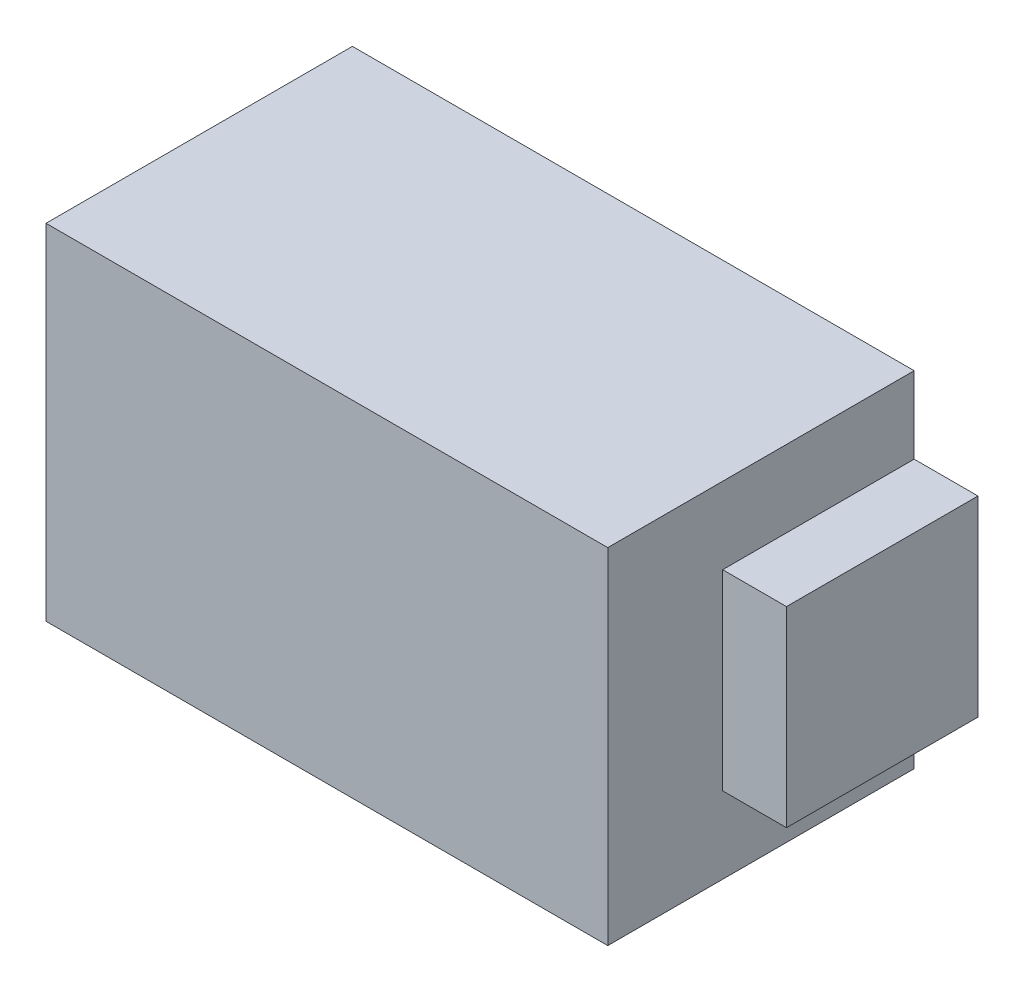
ISO-10303-21;
HEADER;
FILE_DESCRIPTION(('STEP AP214'),'2;1');
FILE_NAME('part.step','',(''),(''),'','','');
FILE_SCHEMA(('AUTOMOTIVE_DESIGN { 1 0 10303 214 1 1 1 1 }'));
ENDSEC;
DATA;
#1=APPLICATION_CONTEXT('core data for automotive mechanical design processes');
#2=APPLICATION_PROTOCOL_DEFINITION('international standard','automotive_design',2000,#1);
#3=PRODUCT_CONTEXT('',#1,'mechanical');
#4=PRODUCT('Part','Part','',(#3));
#5=PRODUCT_RELATED_PRODUCT_CATEGORY('part','',(#4));
#6=PRODUCT_DEFINITION_FORMATION('','',#4);
#7=PRODUCT_DEFINITION_CONTEXT('part definition',#1,'design');
#8=PRODUCT_DEFINITION('design','',#6,#7);
#9=PRODUCT_DEFINITION_SHAPE('','',#8);
#10=(LENGTH_UNIT() NAMED_UNIT(*) SI_UNIT(.MILLI.,.METRE.));
#11=(NAMED_UNIT(*) PLANE_ANGLE_UNIT() SI_UNIT($,.RADIAN.));
#12=(NAMED_UNIT(*) SI_UNIT($,.STERADIAN.) SOLID_ANGLE_UNIT());
#13=UNCERTAINTY_MEASURE_WITH_UNIT(LENGTH_MEASURE(1.E-05),#10,'distance_accuracy_value','');
#14=(GEOMETRIC_REPRESENTATION_CONTEXT(3) GLOBAL_UNCERTAINTY_ASSIGNED_CONTEXT((#13)) GLOBAL_UNIT_ASSIGNED_CONTEXT((#10,
#11,#12)) REPRESENTATION_CONTEXT('',''));
#15=CARTESIAN_POINT('',(0.,0.,0.));
#16=DIRECTION('',(0.,0.,1.));
#17=DIRECTION('',(1.,0.,0.));
#18=AXIS2_PLACEMENT_3D('',#15,#16,#17);
#19=CARTESIAN_POINT('',(2.71,-0.75,-0.01));
#20=CARTESIAN_POINT('',(2.19,-0.75,-0.01));
#21=CARTESIAN_POINT('',(2.71,-0.75,1.51));
#22=CARTESIAN_POINT('',(2.19,-0.75,1.51));
#23=(BOUNDED_SURFACE() B_SPLINE_SURFACE(1,1,((#19,#20),(#21,#22)),.UNSPECIFIED.,.F.,.F.,
.F.) B_SPLINE_SURFACE_WITH_KNOTS((2,2),(2,2),(-0.001,0.151),(-0.271,-0.219),
.UNSPECIFIED.) GEOMETRIC_REPRESENTATION_ITEM() RATIONAL_B_SPLINE_SURFACE(((1.,1.),(1.,1.))) REPRESENTATION_ITEM('') SURFACE());
#24=CARTESIAN_POINT('',(2.2,-0.75,0.));
#25=CARTESIAN_POINT('',(2.2,-0.75,1.5));
#26=(BOUNDED_CURVE() B_SPLINE_CURVE(1,(#24,#25),.UNSPECIFIED.,.F.,
.F.) B_SPLINE_CURVE_WITH_KNOTS((2,2),(0.,0.15),
.UNSPECIFIED.) CURVE() GEOMETRIC_REPRESENTATION_ITEM() RATIONAL_B_SPLINE_CURVE((1.,1.)) REPRESENTATION_ITEM(''));
#27=CARTESIAN_POINT('',(2.2,-0.75,0.));
#28=VERTEX_POINT('',#27);
#29=CARTESIAN_POINT('',(2.2,-0.75,1.5));
#30=VERTEX_POINT('',#29);
#31=EDGE_CURVE('E161',#28,#30,#26,.T.);
#32=CARTESIAN_POINT('',(2.7,-0.75,0.));
#33=CARTESIAN_POINT('',(2.2,-0.75,0.));
#34=(BOUNDED_CURVE() B_SPLINE_CURVE(1,(#32,#33),.UNSPECIFIED.,.F.,
.F.) B_SPLINE_CURVE_WITH_KNOTS((2,2),(-0.27,-0.22),
.UNSPECIFIED.) CURVE() GEOMETRIC_REPRESENTATION_ITEM() RATIONAL_B_SPLINE_CURVE((1.,1.)) REPRESENTATION_ITEM(''));
#35=CARTESIAN_POINT('',(2.7,-0.75,0.));
#36=VERTEX_POINT('',#35);
#37=EDGE_CURVE('E236',#36,#28,#34,.T.);
#38=CARTESIAN_POINT('',(2.7,-0.75,1.5));
#39=CARTESIAN_POINT('',(2.7,-0.75,0.));
#40=(BOUNDED_CURVE() B_SPLINE_CURVE(1,(#38,#39),.UNSPECIFIED.,.F.,
.F.) B_SPLINE_CURVE_WITH_KNOTS((2,2),(0.,0.15),
.UNSPECIFIED.) CURVE() GEOMETRIC_REPRESENTATION_ITEM() RATIONAL_B_SPLINE_CURVE((1.,1.)) REPRESENTATION_ITEM(''));
#41=CARTESIAN_POINT('',(2.7,-0.75,1.5));
#42=VERTEX_POINT('',#41);
#43=EDGE_CURVE('E293',#42,#36,#40,.T.);
#44=CARTESIAN_POINT('',(2.7,-0.75,1.5));
#45=CARTESIAN_POINT('',(2.2,-0.75,1.5));
#46=(BOUNDED_CURVE() B_SPLINE_CURVE(1,(#44,#45),.UNSPECIFIED.,.F.,
.F.) B_SPLINE_CURVE_WITH_KNOTS((2,2),(-0.27,-0.22),
.UNSPECIFIED.) CURVE() GEOMETRIC_REPRESENTATION_ITEM() RATIONAL_B_SPLINE_CURVE((1.,1.)) REPRESENTATION_ITEM(''));
#47=EDGE_CURVE('E11',#42,#30,#46,.T.);
#48=ORIENTED_EDGE('',*,*,#31,.F.);
#49=ORIENTED_EDGE('',*,*,#37,.F.);
#50=ORIENTED_EDGE('',*,*,#43,.F.);
#51=ORIENTED_EDGE('',*,*,#47,.T.);
#52=EDGE_LOOP('',(#48,#49,#50,#51));
#53=FACE_BOUND('',#52,.T.);
#54=ADVANCED_FACE('F17',(#53),#23,.T.);
#55=CARTESIAN_POINT('',(2.71,-0.76,1.5));
#56=CARTESIAN_POINT('',(2.19,-0.76,1.5));
#57=CARTESIAN_POINT('',(2.71,0.76,1.5));
#58=CARTESIAN_POINT('',(2.19,0.76,1.5));
#59=(BOUNDED_SURFACE() B_SPLINE_SURFACE(1,1,((#55,#56),(#57,#58)),.UNSPECIFIED.,.F.,.F.,
.F.) B_SPLINE_SURFACE_WITH_KNOTS((2,2),(2,2),(-0.001,0.151),(-0.271,-0.219),
.UNSPECIFIED.) GEOMETRIC_REPRESENTATION_ITEM() RATIONAL_B_SPLINE_SURFACE(((1.,1.),(1.,1.))) REPRESENTATION_ITEM('') SURFACE());
#60=CARTESIAN_POINT('',(2.2,-0.75,1.5));
#61=CARTESIAN_POINT('',(2.2,0.75,1.5));
#62=(BOUNDED_CURVE() B_SPLINE_CURVE(1,(#60,#61),.UNSPECIFIED.,.F.,
.F.) B_SPLINE_CURVE_WITH_KNOTS((2,2),(0.03,0.18),
.UNSPECIFIED.) CURVE() GEOMETRIC_REPRESENTATION_ITEM() RATIONAL_B_SPLINE_CURVE((1.,1.)) REPRESENTATION_ITEM(''));
#63=CARTESIAN_POINT('',(2.2,0.75,1.5));
#64=VERTEX_POINT('',#63);
#65=EDGE_CURVE('E154',#30,#64,#62,.T.);
#66=CARTESIAN_POINT('',(2.7,0.75,1.5));
#67=CARTESIAN_POINT('',(2.7,-0.75,1.5));
#68=(BOUNDED_CURVE() B_SPLINE_CURVE(1,(#66,#67),.UNSPECIFIED.,.F.,
.F.) B_SPLINE_CURVE_WITH_KNOTS((2,2),(0.,0.15),
.UNSPECIFIED.) CURVE() GEOMETRIC_REPRESENTATION_ITEM() RATIONAL_B_SPLINE_CURVE((1.,1.)) REPRESENTATION_ITEM(''));
#69=CARTESIAN_POINT('',(2.7,0.75,1.5));
#70=VERTEX_POINT('',#69);
#71=EDGE_CURVE('E204',#70,#42,#68,.T.);
#72=CARTESIAN_POINT('',(2.7,0.75,1.5));
#73=CARTESIAN_POINT('',(2.2,0.75,1.5));
#74=(BOUNDED_CURVE() B_SPLINE_CURVE(1,(#72,#73),.UNSPECIFIED.,.F.,
.F.) B_SPLINE_CURVE_WITH_KNOTS((2,2),(-0.27,-0.22),
.UNSPECIFIED.) CURVE() GEOMETRIC_REPRESENTATION_ITEM() RATIONAL_B_SPLINE_CURVE((1.,1.)) REPRESENTATION_ITEM(''));
#75=EDGE_CURVE('E31',#70,#64,#74,.T.);
#76=ORIENTED_EDGE('',*,*,#65,.F.);
#77=ORIENTED_EDGE('',*,*,#47,.F.);
#78=ORIENTED_EDGE('',*,*,#71,.F.);
#79=ORIENTED_EDGE('',*,*,#75,.T.);
#80=EDGE_LOOP('',(#76,#77,#78,#79));
#81=FACE_BOUND('',#80,.T.);
#82=ADVANCED_FACE('F384',(#81),#59,.T.);
#83=CARTESIAN_POINT('',(-2.19,-0.76,1.5));
#84=CARTESIAN_POINT('',(-2.71,-0.76,1.5));
#85=CARTESIAN_POINT('',(-2.19,0.76,1.5));
#86=CARTESIAN_POINT('',(-2.71,0.76,1.5));
#87=(BOUNDED_SURFACE() B_SPLINE_SURFACE(1,1,((#83,#84),(#85,#86)),.UNSPECIFIED.,.F.,.F.,
.F.) B_SPLINE_SURFACE_WITH_KNOTS((2,2),(2,2),(-0.001,0.151),(0.219,0.271),
.UNSPECIFIED.) GEOMETRIC_REPRESENTATION_ITEM() RATIONAL_B_SPLINE_SURFACE(((1.,1.),(1.,1.))) REPRESENTATION_ITEM('') SURFACE());
#88=CARTESIAN_POINT('',(-2.2,0.75,1.5));
#89=CARTESIAN_POINT('',(-2.2,-0.75,1.5));
#90=(BOUNDED_CURVE() B_SPLINE_CURVE(1,(#88,#89),.UNSPECIFIED.,.F.,
.F.) B_SPLINE_CURVE_WITH_KNOTS((2,2),(-0.045,0.105),
.UNSPECIFIED.) CURVE() GEOMETRIC_REPRESENTATION_ITEM() RATIONAL_B_SPLINE_CURVE((1.,1.)) REPRESENTATION_ITEM(''));
#91=CARTESIAN_POINT('',(-2.2,0.75,1.5));
#92=VERTEX_POINT('',#91);
#93=CARTESIAN_POINT('',(-2.2,-0.75,1.5));
#94=VERTEX_POINT('',#93);
#95=EDGE_CURVE('E195',#92,#94,#90,.T.);
#96=CARTESIAN_POINT('',(-2.2,0.75,1.5));
#97=CARTESIAN_POINT('',(-2.7,0.75,1.5));
#98=(BOUNDED_CURVE() B_SPLINE_CURVE(1,(#96,#97),.UNSPECIFIED.,.F.,
.F.) B_SPLINE_CURVE_WITH_KNOTS((2,2),(0.22,0.27),
.UNSPECIFIED.) CURVE() GEOMETRIC_REPRESENTATION_ITEM() RATIONAL_B_SPLINE_CURVE((1.,1.)) REPRESENTATION_ITEM(''));
#99=CARTESIAN_POINT('',(-2.7,0.75,1.5));
#100=VERTEX_POINT('',#99);
#101=EDGE_CURVE('E269',#92,#100,#98,.T.);
#102=CARTESIAN_POINT('',(-2.7,-0.75,1.5));
#103=CARTESIAN_POINT('',(-2.7,0.75,1.5));
#104=(BOUNDED_CURVE() B_SPLINE_CURVE(1,(#102,#103),.UNSPECIFIED.,.F.,
.F.) B_SPLINE_CURVE_WITH_KNOTS((2,2),(-0.15,0.),
.UNSPECIFIED.) CURVE() GEOMETRIC_REPRESENTATION_ITEM() RATIONAL_B_SPLINE_CURVE((1.,1.)) REPRESENTATION_ITEM(''));
#105=CARTESIAN_POINT('',(-2.7,-0.75,1.5));
#106=VERTEX_POINT('',#105);
#107=EDGE_CURVE('E206',#106,#100,#104,.T.);
#108=CARTESIAN_POINT('',(-2.2,-0.75,1.5));
#109=CARTESIAN_POINT('',(-2.7,-0.75,1.5));
#110=(BOUNDED_CURVE() B_SPLINE_CURVE(1,(#108,#109),.UNSPECIFIED.,.F.,
.F.) B_SPLINE_CURVE_WITH_KNOTS((2,2),(0.22,0.27),
.UNSPECIFIED.) CURVE() GEOMETRIC_REPRESENTATION_ITEM() RATIONAL_B_SPLINE_CURVE((1.,1.)) REPRESENTATION_ITEM(''));
#111=EDGE_CURVE('E205',#94,#106,#110,.T.);
#112=ORIENTED_EDGE('',*,*,#95,.F.);
#113=ORIENTED_EDGE('',*,*,#101,.T.);
#114=ORIENTED_EDGE('',*,*,#107,.F.);
#115=ORIENTED_EDGE('',*,*,#111,.F.);
#116=EDGE_LOOP('',(#112,#113,#114,#115));
#117=FACE_BOUND('',#116,.T.);
#118=ADVANCED_FACE('F434',(#117),#87,.T.);
#119=CARTESIAN_POINT('',(2.71,0.75,1.51));
#120=CARTESIAN_POINT('',(2.19,0.75,1.51));
#121=CARTESIAN_POINT('',(2.71,0.75,-0.01));
#122=CARTESIAN_POINT('',(2.19,0.75,-0.01));
#123=(BOUNDED_SURFACE() B_SPLINE_SURFACE(1,1,((#119,#120),(#121,#122)),.UNSPECIFIED.,.F.,.F.,
.F.) B_SPLINE_SURFACE_WITH_KNOTS((2,2),(2,2),(-0.001,0.151),(-0.271,-0.219),
.UNSPECIFIED.) GEOMETRIC_REPRESENTATION_ITEM() RATIONAL_B_SPLINE_SURFACE(((1.,1.),(1.,1.))) REPRESENTATION_ITEM('') SURFACE());
#124=CARTESIAN_POINT('',(2.2,0.75,1.5));
#125=CARTESIAN_POINT('',(2.2,0.75,0.));
#126=(BOUNDED_CURVE() B_SPLINE_CURVE(1,(#124,#125),.UNSPECIFIED.,.F.,
.F.) B_SPLINE_CURVE_WITH_KNOTS((2,2),(-0.075,0.075),
.UNSPECIFIED.) CURVE() GEOMETRIC_REPRESENTATION_ITEM() RATIONAL_B_SPLINE_CURVE((1.,1.)) REPRESENTATION_ITEM(''));
#127=CARTESIAN_POINT('',(2.2,0.75,0.));
#128=VERTEX_POINT('',#127);
#129=EDGE_CURVE('E129',#64,#128,#126,.T.);
#130=CARTESIAN_POINT('',(2.7,0.75,0.));
#131=CARTESIAN_POINT('',(2.7,0.75,1.5));
#132=(BOUNDED_CURVE() B_SPLINE_CURVE(1,(#130,#131),.UNSPECIFIED.,.F.,
.F.) B_SPLINE_CURVE_WITH_KNOTS((2,2),(0.,0.15),
.UNSPECIFIED.) CURVE() GEOMETRIC_REPRESENTATION_ITEM() RATIONAL_B_SPLINE_CURVE((1.,1.)) REPRESENTATION_ITEM(''));
#133=CARTESIAN_POINT('',(2.7,0.75,0.));
#134=VERTEX_POINT('',#133);
#135=EDGE_CURVE('E132',#134,#70,#132,.T.);
#136=CARTESIAN_POINT('',(2.2,0.75,0.));
#137=CARTESIAN_POINT('',(2.7,0.75,0.));
#138=(BOUNDED_CURVE() B_SPLINE_CURVE(1,(#136,#137),.UNSPECIFIED.,.F.,
.F.) B_SPLINE_CURVE_WITH_KNOTS((2,2),(0.22,0.27),
.UNSPECIFIED.) CURVE() GEOMETRIC_REPRESENTATION_ITEM() RATIONAL_B_SPLINE_CURVE((1.,1.)) REPRESENTATION_ITEM(''));
#139=EDGE_CURVE('E125',#128,#134,#138,.T.);
#140=ORIENTED_EDGE('',*,*,#129,.F.);
#141=ORIENTED_EDGE('',*,*,#75,.F.);
#142=ORIENTED_EDGE('',*,*,#135,.F.);
#143=ORIENTED_EDGE('',*,*,#139,.F.);
#144=EDGE_LOOP('',(#140,#141,#142,#143));
#145=FACE_BOUND('',#144,.T.);
#146=ADVANCED_FACE('F127',(#145),#123,.T.);
#147=CARTESIAN_POINT('',(-2.19,0.75,1.51));
#148=CARTESIAN_POINT('',(-2.71,0.75,1.51));
#149=CARTESIAN_POINT('',(-2.19,0.75,-0.01));
#150=CARTESIAN_POINT('',(-2.71,0.75,-0.01));
#151=(BOUNDED_SURFACE() B_SPLINE_SURFACE(1,1,((#147,#148),(#149,#150)),.UNSPECIFIED.,.F.,.F.,
.F.) B_SPLINE_SURFACE_WITH_KNOTS((2,2),(2,2),(-0.001,0.151),(0.219,0.271),
.UNSPECIFIED.) GEOMETRIC_REPRESENTATION_ITEM() RATIONAL_B_SPLINE_SURFACE(((1.,1.),(1.,1.))) REPRESENTATION_ITEM('') SURFACE());
#152=CARTESIAN_POINT('',(-2.2,0.75,0.));
#153=CARTESIAN_POINT('',(-2.2,0.75,1.5));
#154=(BOUNDED_CURVE() B_SPLINE_CURVE(1,(#152,#153),.UNSPECIFIED.,.F.,
.F.) B_SPLINE_CURVE_WITH_KNOTS((2,2),(-0.075,0.075),
.UNSPECIFIED.) CURVE() GEOMETRIC_REPRESENTATION_ITEM() RATIONAL_B_SPLINE_CURVE((1.,1.)) REPRESENTATION_ITEM(''));
#155=CARTESIAN_POINT('',(-2.2,0.75,0.));
#156=VERTEX_POINT('',#155);
#157=EDGE_CURVE('E186',#156,#92,#154,.T.);
#158=CARTESIAN_POINT('',(-2.7,0.75,0.));
#159=CARTESIAN_POINT('',(-2.2,0.75,0.));
#160=(BOUNDED_CURVE() B_SPLINE_CURVE(1,(#158,#159),.UNSPECIFIED.,.F.,
.F.) B_SPLINE_CURVE_WITH_KNOTS((2,2),(-0.27,-0.22),
.UNSPECIFIED.) CURVE() GEOMETRIC_REPRESENTATION_ITEM() RATIONAL_B_SPLINE_CURVE((1.,1.)) REPRESENTATION_ITEM(''));
#161=CARTESIAN_POINT('',(-2.7,0.75,0.));
#162=VERTEX_POINT('',#161);
#163=EDGE_CURVE('E138',#162,#156,#160,.T.);
#164=CARTESIAN_POINT('',(-2.7,0.75,1.5));
#165=CARTESIAN_POINT('',(-2.7,0.75,0.));
#166=(BOUNDED_CURVE() B_SPLINE_CURVE(1,(#164,#165),.UNSPECIFIED.,.F.,
.F.) B_SPLINE_CURVE_WITH_KNOTS((2,2),(-0.15,0.),
.UNSPECIFIED.) CURVE() GEOMETRIC_REPRESENTATION_ITEM() RATIONAL_B_SPLINE_CURVE((1.,1.)) REPRESENTATION_ITEM(''));
#167=EDGE_CURVE('E215',#100,#162,#166,.T.);
#168=ORIENTED_EDGE('',*,*,#157,.F.);
#169=ORIENTED_EDGE('',*,*,#163,.F.);
#170=ORIENTED_EDGE('',*,*,#167,.F.);
#171=ORIENTED_EDGE('',*,*,#101,.F.);
#172=EDGE_LOOP('',(#168,#169,#170,#171));
#173=FACE_BOUND('',#172,.T.);
#174=ADVANCED_FACE('F579',(#173),#151,.T.);
#175=CARTESIAN_POINT('',(2.7,-0.76,1.51));
#176=CARTESIAN_POINT('',(2.7,0.76,1.51));
#177=CARTESIAN_POINT('',(2.7,-0.76,-0.01));
#178=CARTESIAN_POINT('',(2.7,0.76,-0.01));
#179=(BOUNDED_SURFACE() B_SPLINE_SURFACE(1,1,((#175,#176),(#177,#178)),.UNSPECIFIED.,.F.,.F.,
.F.) B_SPLINE_SURFACE_WITH_KNOTS((2,2),(2,2),(-0.076,0.076),(-0.076,0.076),
.UNSPECIFIED.) GEOMETRIC_REPRESENTATION_ITEM() RATIONAL_B_SPLINE_SURFACE(((1.,1.),(1.,1.))) REPRESENTATION_ITEM('') SURFACE());
#180=CARTESIAN_POINT('',(2.7,-0.75,0.));
#181=CARTESIAN_POINT('',(2.7,0.75,0.));
#182=(BOUNDED_CURVE() B_SPLINE_CURVE(1,(#180,#181),.UNSPECIFIED.,.F.,
.F.) B_SPLINE_CURVE_WITH_KNOTS((2,2),(-0.21,-0.06),
.UNSPECIFIED.) CURVE() GEOMETRIC_REPRESENTATION_ITEM() RATIONAL_B_SPLINE_CURVE((1.,1.)) REPRESENTATION_ITEM(''));
#183=EDGE_CURVE('E137',#36,#134,#182,.T.);
#184=ORIENTED_EDGE('',*,*,#183,.T.);
#185=ORIENTED_EDGE('',*,*,#135,.T.);
#186=ORIENTED_EDGE('',*,*,#71,.T.);
#187=ORIENTED_EDGE('',*,*,#43,.T.);
#188=EDGE_LOOP('',(#184,#185,#186,#187));
#189=FACE_BOUND('',#188,.T.);
#190=ADVANCED_FACE('F386',(#189),#179,.T.);
#191=CARTESIAN_POINT('',(-2.19,-0.75,-0.01));
#192=CARTESIAN_POINT('',(-2.71,-0.75,-0.01));
#193=CARTESIAN_POINT('',(-2.19,-0.75,1.51));
#194=CARTESIAN_POINT('',(-2.71,-0.75,1.51));
#195=(BOUNDED_SURFACE() B_SPLINE_SURFACE(1,1,((#191,#192),(#193,#194)),.UNSPECIFIED.,.F.,.F.,
.F.) B_SPLINE_SURFACE_WITH_KNOTS((2,2),(2,2),(-0.001,0.151),(0.219,0.271),
.UNSPECIFIED.) GEOMETRIC_REPRESENTATION_ITEM() RATIONAL_B_SPLINE_SURFACE(((1.,1.),(1.,1.))) REPRESENTATION_ITEM('') SURFACE());
#196=CARTESIAN_POINT('',(-2.2,-0.75,1.5));
#197=CARTESIAN_POINT('',(-2.2,-0.75,0.));
#198=(BOUNDED_CURVE() B_SPLINE_CURVE(1,(#196,#197),.UNSPECIFIED.,.F.,
.F.) B_SPLINE_CURVE_WITH_KNOTS((2,2),(-0.15,0.),
.UNSPECIFIED.) CURVE() GEOMETRIC_REPRESENTATION_ITEM() RATIONAL_B_SPLINE_CURVE((1.,1.)) REPRESENTATION_ITEM(''));
#199=CARTESIAN_POINT('',(-2.2,-0.75,0.));
#200=VERTEX_POINT('',#199);
#201=EDGE_CURVE('E309',#94,#200,#198,.T.);
#202=CARTESIAN_POINT('',(-2.7,-0.75,0.));
#203=CARTESIAN_POINT('',(-2.7,-0.75,1.5));
#204=(BOUNDED_CURVE() B_SPLINE_CURVE(1,(#202,#203),.UNSPECIFIED.,.F.,
.F.) B_SPLINE_CURVE_WITH_KNOTS((2,2),(-0.15,0.),
.UNSPECIFIED.) CURVE() GEOMETRIC_REPRESENTATION_ITEM() RATIONAL_B_SPLINE_CURVE((1.,1.)) REPRESENTATION_ITEM(''));
#205=CARTESIAN_POINT('',(-2.7,-0.75,0.));
#206=VERTEX_POINT('',#205);
#207=EDGE_CURVE('E22',#206,#106,#204,.T.);
#208=CARTESIAN_POINT('',(-2.2,-0.75,0.));
#209=CARTESIAN_POINT('',(-2.7,-0.75,0.));
#210=(BOUNDED_CURVE() B_SPLINE_CURVE(1,(#208,#209),.UNSPECIFIED.,.F.,
.F.) B_SPLINE_CURVE_WITH_KNOTS((2,2),(0.22,0.27),
.UNSPECIFIED.) CURVE() GEOMETRIC_REPRESENTATION_ITEM() RATIONAL_B_SPLINE_CURVE((1.,1.)) REPRESENTATION_ITEM(''));
#211=EDGE_CURVE('E177',#200,#206,#210,.T.);
#212=ORIENTED_EDGE('',*,*,#201,.F.);
#213=ORIENTED_EDGE('',*,*,#111,.T.);
#214=ORIENTED_EDGE('',*,*,#207,.F.);
#215=ORIENTED_EDGE('',*,*,#211,.F.);
#216=EDGE_LOOP('',(#212,#213,#214,#215));
#217=FACE_BOUND('',#216,.T.);
#218=ADVANCED_FACE('F428',(#217),#195,.T.);
#219=CARTESIAN_POINT('',(-2.7,-0.76,-0.01));
#220=CARTESIAN_POINT('',(-2.7,0.76,-0.01));
#221=CARTESIAN_POINT('',(-2.7,-0.76,1.51));
#222=CARTESIAN_POINT('',(-2.7,0.76,1.51));
#223=(BOUNDED_SURFACE() B_SPLINE_SURFACE(1,1,((#219,#220),(#221,#222)),.UNSPECIFIED.,.F.,.F.,
.F.) B_SPLINE_SURFACE_WITH_KNOTS((2,2),(2,2),(-0.076,0.076),(-0.076,0.076),
.UNSPECIFIED.) GEOMETRIC_REPRESENTATION_ITEM() RATIONAL_B_SPLINE_SURFACE(((1.,1.),(1.,1.))) REPRESENTATION_ITEM('') SURFACE());
#224=CARTESIAN_POINT('',(-2.7,0.75,0.));
#225=CARTESIAN_POINT('',(-2.7,-0.75,0.));
#226=(BOUNDED_CURVE() B_SPLINE_CURVE(1,(#224,#225),.UNSPECIFIED.,.F.,
.F.) B_SPLINE_CURVE_WITH_KNOTS((2,2),(0.06,0.21),
.UNSPECIFIED.) CURVE() GEOMETRIC_REPRESENTATION_ITEM() RATIONAL_B_SPLINE_CURVE((1.,1.)) REPRESENTATION_ITEM(''));
#227=EDGE_CURVE('E166',#162,#206,#226,.T.);
#228=ORIENTED_EDGE('',*,*,#227,.T.);
#229=ORIENTED_EDGE('',*,*,#207,.T.);
#230=ORIENTED_EDGE('',*,*,#107,.T.);
#231=ORIENTED_EDGE('',*,*,#167,.T.);
#232=EDGE_LOOP('',(#228,#229,#230,#231));
#233=FACE_BOUND('',#232,.T.);
#234=ADVANCED_FACE('F437',(#233),#223,.T.);
#235=CARTESIAN_POINT('',(2.71,-1.36,0.));
#236=CARTESIAN_POINT('',(2.71,1.36,0.));
#237=CARTESIAN_POINT('',(-2.71,-1.36,0.));
#238=CARTESIAN_POINT('',(-2.71,1.36,0.));
#239=(BOUNDED_SURFACE() B_SPLINE_SURFACE(1,1,((#235,#236),(#237,#238)),.UNSPECIFIED.,.F.,.F.,
.F.) B_SPLINE_SURFACE_WITH_KNOTS((2,2),(2,2),(-0.271,0.271),(-0.136,0.136),
.UNSPECIFIED.) GEOMETRIC_REPRESENTATION_ITEM() RATIONAL_B_SPLINE_SURFACE(((1.,1.),(1.,1.))) REPRESENTATION_ITEM('') SURFACE());
#240=CARTESIAN_POINT('',(2.2,-0.75,0.));
#241=CARTESIAN_POINT('',(2.2,-1.35,0.));
#242=(BOUNDED_CURVE() B_SPLINE_CURVE(1,(#240,#241),.UNSPECIFIED.,.F.,
.F.) B_SPLINE_CURVE_WITH_KNOTS((2,2),(0.21,0.27),
.UNSPECIFIED.) CURVE() GEOMETRIC_REPRESENTATION_ITEM() RATIONAL_B_SPLINE_CURVE((1.,1.)) REPRESENTATION_ITEM(''));
#243=CARTESIAN_POINT('',(2.2,-1.35,0.));
#244=VERTEX_POINT('',#243);
#245=EDGE_CURVE('E150',#28,#244,#242,.T.);
#246=CARTESIAN_POINT('',(2.2,-1.35,0.));
#247=CARTESIAN_POINT('',(-2.2,-1.35,0.));
#248=(BOUNDED_CURVE() B_SPLINE_CURVE(1,(#246,#247),.UNSPECIFIED.,.F.,
.F.) B_SPLINE_CURVE_WITH_KNOTS((2,2),(0.,0.44),
.UNSPECIFIED.) CURVE() GEOMETRIC_REPRESENTATION_ITEM() RATIONAL_B_SPLINE_CURVE((1.,1.)) REPRESENTATION_ITEM(''));
#249=CARTESIAN_POINT('',(-2.2,-1.35,0.));
#250=VERTEX_POINT('',#249);
#251=EDGE_CURVE('E216',#244,#250,#248,.T.);
#252=CARTESIAN_POINT('',(-2.2,-1.35,0.));
#253=CARTESIAN_POINT('',(-2.2,-0.75,0.));
#254=(BOUNDED_CURVE() B_SPLINE_CURVE(1,(#252,#253),.UNSPECIFIED.,.F.,
.F.) B_SPLINE_CURVE_WITH_KNOTS((2,2),(0.,0.06),
.UNSPECIFIED.) CURVE() GEOMETRIC_REPRESENTATION_ITEM() RATIONAL_B_SPLINE_CURVE((1.,1.)) REPRESENTATION_ITEM(''));
#255=EDGE_CURVE('E310',#250,#200,#254,.T.);
#256=CARTESIAN_POINT('',(-2.2,0.75,0.));
#257=CARTESIAN_POINT('',(-2.2,1.35,0.));
#258=(BOUNDED_CURVE() B_SPLINE_CURVE(1,(#256,#257),.UNSPECIFIED.,.F.,
.F.) B_SPLINE_CURVE_WITH_KNOTS((2,2),(0.21,0.27),
.UNSPECIFIED.) CURVE() GEOMETRIC_REPRESENTATION_ITEM() RATIONAL_B_SPLINE_CURVE((1.,1.)) REPRESENTATION_ITEM(''));
#259=CARTESIAN_POINT('',(-2.2,1.35,0.));
#260=VERTEX_POINT('',#259);
#261=EDGE_CURVE('E196',#156,#260,#258,.T.);
#262=CARTESIAN_POINT('',(-2.2,1.35,0.));
#263=CARTESIAN_POINT('',(2.2,1.35,0.));
#264=(BOUNDED_CURVE() B_SPLINE_CURVE(1,(#262,#263),.UNSPECIFIED.,.F.,
.F.) B_SPLINE_CURVE_WITH_KNOTS((2,2),(0.,0.44),
.UNSPECIFIED.) CURVE() GEOMETRIC_REPRESENTATION_ITEM() RATIONAL_B_SPLINE_CURVE((1.,1.)) REPRESENTATION_ITEM(''));
#265=CARTESIAN_POINT('',(2.2,1.35,0.));
#266=VERTEX_POINT('',#265);
#267=EDGE_CURVE('E146',#260,#266,#264,.T.);
#268=CARTESIAN_POINT('',(2.2,1.35,0.));
#269=CARTESIAN_POINT('',(2.2,0.75,0.));
#270=(BOUNDED_CURVE() B_SPLINE_CURVE(1,(#268,#269),.UNSPECIFIED.,.F.,
.F.) B_SPLINE_CURVE_WITH_KNOTS((2,2),(0.,0.06),
.UNSPECIFIED.) CURVE() GEOMETRIC_REPRESENTATION_ITEM() RATIONAL_B_SPLINE_CURVE((1.,1.)) REPRESENTATION_ITEM(''));
#271=EDGE_CURVE('E142',#266,#128,#270,.T.);
#272=ORIENTED_EDGE('',*,*,#245,.T.);
#273=ORIENTED_EDGE('',*,*,#251,.T.);
#274=ORIENTED_EDGE('',*,*,#255,.T.);
#275=ORIENTED_EDGE('',*,*,#211,.T.);
#276=ORIENTED_EDGE('',*,*,#227,.F.);
#277=ORIENTED_EDGE('',*,*,#163,.T.);
#278=ORIENTED_EDGE('',*,*,#261,.T.);
#279=ORIENTED_EDGE('',*,*,#267,.T.);
#280=ORIENTED_EDGE('',*,*,#271,.T.);
#281=ORIENTED_EDGE('',*,*,#139,.T.);
#282=ORIENTED_EDGE('',*,*,#183,.F.);
#283=ORIENTED_EDGE('',*,*,#37,.T.);
#284=EDGE_LOOP('',(#272,#273,#274,#275,#276,#277,#278,#279,#280,#281,#282,#283));
#285=FACE_BOUND('',#284,.T.);
#286=ADVANCED_FACE('F143',(#285),#239,.T.);
#287=CARTESIAN_POINT('',(2.2,-1.36,-0.01));
#288=CARTESIAN_POINT('',(2.2,-1.36,2.41));
#289=CARTESIAN_POINT('',(2.2,1.36,-0.01));
#290=CARTESIAN_POINT('',(2.2,1.36,2.41));
#291=(BOUNDED_SURFACE() B_SPLINE_SURFACE(1,1,((#287,#288),(#289,#290)),.UNSPECIFIED.,.F.,.F.,
.F.) B_SPLINE_SURFACE_WITH_KNOTS((2,2),(2,2),(-0.001,0.271),(-0.001,0.241),
.UNSPECIFIED.) GEOMETRIC_REPRESENTATION_ITEM() RATIONAL_B_SPLINE_SURFACE(((1.,1.),(1.,1.))) REPRESENTATION_ITEM('') SURFACE());
#292=CARTESIAN_POINT('',(2.2,1.35,0.));
#293=CARTESIAN_POINT('',(2.2,1.35,2.4));
#294=(BOUNDED_CURVE() B_SPLINE_CURVE(1,(#292,#293),.UNSPECIFIED.,.F.,
.F.) B_SPLINE_CURVE_WITH_KNOTS((2,2),(0.,0.24),
.UNSPECIFIED.) CURVE() GEOMETRIC_REPRESENTATION_ITEM() RATIONAL_B_SPLINE_CURVE((1.,1.)) REPRESENTATION_ITEM(''));
#295=CARTESIAN_POINT('',(2.2,1.35,2.4));
#296=VERTEX_POINT('',#295);
#297=EDGE_CURVE('E301',#266,#296,#294,.T.);
#298=CARTESIAN_POINT('',(2.2,-1.35,2.4));
#299=CARTESIAN_POINT('',(2.2,1.35,2.4));
#300=(BOUNDED_CURVE() B_SPLINE_CURVE(1,(#298,#299),.UNSPECIFIED.,.F.,
.F.) B_SPLINE_CURVE_WITH_KNOTS((2,2),(-0.27,0.),
.UNSPECIFIED.) CURVE() GEOMETRIC_REPRESENTATION_ITEM() RATIONAL_B_SPLINE_CURVE((1.,1.)) REPRESENTATION_ITEM(''));
#301=CARTESIAN_POINT('',(2.2,-1.35,2.4));
#302=VERTEX_POINT('',#301);
#303=EDGE_CURVE('E251',#302,#296,#300,.T.);
#304=CARTESIAN_POINT('',(2.2,-1.35,0.));
#305=CARTESIAN_POINT('',(2.2,-1.35,2.4));
#306=(BOUNDED_CURVE() B_SPLINE_CURVE(1,(#304,#305),.UNSPECIFIED.,.F.,
.F.) B_SPLINE_CURVE_WITH_KNOTS((2,2),(0.,0.24),
.UNSPECIFIED.) CURVE() GEOMETRIC_REPRESENTATION_ITEM() RATIONAL_B_SPLINE_CURVE((1.,1.)) REPRESENTATION_ITEM(''));
#307=EDGE_CURVE('E225',#244,#302,#306,.T.);
#308=ORIENTED_EDGE('',*,*,#31,.T.);
#309=ORIENTED_EDGE('',*,*,#65,.T.);
#310=ORIENTED_EDGE('',*,*,#129,.T.);
#311=ORIENTED_EDGE('',*,*,#271,.F.);
#312=ORIENTED_EDGE('',*,*,#297,.T.);
#313=ORIENTED_EDGE('',*,*,#303,.F.);
#314=ORIENTED_EDGE('',*,*,#307,.F.);
#315=ORIENTED_EDGE('',*,*,#245,.F.);
#316=EDGE_LOOP('',(#308,#309,#310,#311,#312,#313,#314,#315));
#317=FACE_BOUND('',#316,.T.);
#318=ADVANCED_FACE('F153',(#317),#291,.T.);
#319=CARTESIAN_POINT('',(-2.2,1.36,-0.01));
#320=CARTESIAN_POINT('',(-2.2,1.36,2.41));
#321=CARTESIAN_POINT('',(-2.2,-1.36,-0.01));
#322=CARTESIAN_POINT('',(-2.2,-1.36,2.41));
#323=(BOUNDED_SURFACE() B_SPLINE_SURFACE(1,1,((#319,#320),(#321,#322)),.UNSPECIFIED.,.F.,.F.,
.F.) B_SPLINE_SURFACE_WITH_KNOTS((2,2),(2,2),(-0.001,0.271),(-0.001,0.241),
.UNSPECIFIED.) GEOMETRIC_REPRESENTATION_ITEM() RATIONAL_B_SPLINE_SURFACE(((1.,1.),(1.,1.))) REPRESENTATION_ITEM('') SURFACE());
#324=CARTESIAN_POINT('',(-2.2,-1.35,0.));
#325=CARTESIAN_POINT('',(-2.2,-1.35,2.4));
#326=(BOUNDED_CURVE() B_SPLINE_CURVE(1,(#324,#325),.UNSPECIFIED.,.F.,
.F.) B_SPLINE_CURVE_WITH_KNOTS((2,2),(0.,0.24),
.UNSPECIFIED.) CURVE() GEOMETRIC_REPRESENTATION_ITEM() RATIONAL_B_SPLINE_CURVE((1.,1.)) REPRESENTATION_ITEM(''));
#327=CARTESIAN_POINT('',(-2.2,-1.35,2.4));
#328=VERTEX_POINT('',#327);
#329=EDGE_CURVE('E235',#250,#328,#326,.T.);
#330=CARTESIAN_POINT('',(-2.2,1.35,2.4));
#331=CARTESIAN_POINT('',(-2.2,-1.35,2.4));
#332=(BOUNDED_CURVE() B_SPLINE_CURVE(1,(#330,#331),.UNSPECIFIED.,.F.,
.F.) B_SPLINE_CURVE_WITH_KNOTS((2,2),(-0.27,0.),
.UNSPECIFIED.) CURVE() GEOMETRIC_REPRESENTATION_ITEM() RATIONAL_B_SPLINE_CURVE((1.,1.)) REPRESENTATION_ITEM(''));
#333=CARTESIAN_POINT('',(-2.2,1.35,2.4));
#334=VERTEX_POINT('',#333);
#335=EDGE_CURVE('E226',#334,#328,#332,.T.);
#336=CARTESIAN_POINT('',(-2.2,1.35,0.));
#337=CARTESIAN_POINT('',(-2.2,1.35,2.4));
#338=(BOUNDED_CURVE() B_SPLINE_CURVE(1,(#336,#337),.UNSPECIFIED.,.F.,
.F.) B_SPLINE_CURVE_WITH_KNOTS((2,2),(0.,0.24),
.UNSPECIFIED.) CURVE() GEOMETRIC_REPRESENTATION_ITEM() RATIONAL_B_SPLINE_CURVE((1.,1.)) REPRESENTATION_ITEM(''));
#339=EDGE_CURVE('E234',#260,#334,#338,.T.);
#340=ORIENTED_EDGE('',*,*,#201,.T.);
#341=ORIENTED_EDGE('',*,*,#255,.F.);
#342=ORIENTED_EDGE('',*,*,#329,.T.);
#343=ORIENTED_EDGE('',*,*,#335,.F.);
#344=ORIENTED_EDGE('',*,*,#339,.F.);
#345=ORIENTED_EDGE('',*,*,#261,.F.);
#346=ORIENTED_EDGE('',*,*,#157,.T.);
#347=ORIENTED_EDGE('',*,*,#95,.T.);
#348=EDGE_LOOP('',(#340,#341,#342,#343,#344,#345,#346,#347));
#349=FACE_BOUND('',#348,.T.);
#350=ADVANCED_FACE('F571',(#349),#323,.T.);
#351=CARTESIAN_POINT('',(2.21,1.35,-0.01));
#352=CARTESIAN_POINT('',(2.21,1.35,2.41));
#353=CARTESIAN_POINT('',(-2.21,1.35,-0.01));
#354=CARTESIAN_POINT('',(-2.21,1.35,2.41));
#355=(BOUNDED_SURFACE() B_SPLINE_SURFACE(1,1,((#351,#352),(#353,#354)),.UNSPECIFIED.,.F.,.F.,
.F.) B_SPLINE_SURFACE_WITH_KNOTS((2,2),(2,2),(-0.001,0.441),(-0.001,0.241),
.UNSPECIFIED.) GEOMETRIC_REPRESENTATION_ITEM() RATIONAL_B_SPLINE_SURFACE(((1.,1.),(1.,1.))) REPRESENTATION_ITEM('') SURFACE());
#356=CARTESIAN_POINT('',(2.2,1.35,2.4));
#357=CARTESIAN_POINT('',(-2.2,1.35,2.4));
#358=(BOUNDED_CURVE() B_SPLINE_CURVE(1,(#356,#357),.UNSPECIFIED.,.F.,
.F.) B_SPLINE_CURVE_WITH_KNOTS((2,2),(-0.44,0.),
.UNSPECIFIED.) CURVE() GEOMETRIC_REPRESENTATION_ITEM() RATIONAL_B_SPLINE_CURVE((1.,1.)) REPRESENTATION_ITEM(''));
#359=EDGE_CURVE('E260',#296,#334,#358,.T.);
#360=ORIENTED_EDGE('',*,*,#267,.F.);
#361=ORIENTED_EDGE('',*,*,#339,.T.);
#362=ORIENTED_EDGE('',*,*,#359,.F.);
#363=ORIENTED_EDGE('',*,*,#297,.F.);
#364=EDGE_LOOP('',(#360,#361,#362,#363));
#365=FACE_BOUND('',#364,.T.);
#366=ADVANCED_FACE('F573',(#365),#355,.T.);
#367=CARTESIAN_POINT('',(-2.21,-1.35,-0.01));
#368=CARTESIAN_POINT('',(-2.21,-1.35,2.41));
#369=CARTESIAN_POINT('',(2.21,-1.35,-0.01));
#370=CARTESIAN_POINT('',(2.21,-1.35,2.41));
#371=(BOUNDED_SURFACE() B_SPLINE_SURFACE(1,1,((#367,#368),(#369,#370)),.UNSPECIFIED.,.F.,.F.,
.F.) B_SPLINE_SURFACE_WITH_KNOTS((2,2),(2,2),(-0.001,0.441),(-0.001,0.241),
.UNSPECIFIED.) GEOMETRIC_REPRESENTATION_ITEM() RATIONAL_B_SPLINE_SURFACE(((1.,1.),(1.,1.))) REPRESENTATION_ITEM('') SURFACE());
#372=CARTESIAN_POINT('',(-2.2,-1.35,2.4));
#373=CARTESIAN_POINT('',(2.2,-1.35,2.4));
#374=(BOUNDED_CURVE() B_SPLINE_CURVE(1,(#372,#373),.UNSPECIFIED.,.F.,
.F.) B_SPLINE_CURVE_WITH_KNOTS((2,2),(-0.44,0.),
.UNSPECIFIED.) CURVE() GEOMETRIC_REPRESENTATION_ITEM() RATIONAL_B_SPLINE_CURVE((1.,1.)) REPRESENTATION_ITEM(''));
#375=EDGE_CURVE('E261',#328,#302,#374,.T.);
#376=ORIENTED_EDGE('',*,*,#251,.F.);
#377=ORIENTED_EDGE('',*,*,#307,.T.);
#378=ORIENTED_EDGE('',*,*,#375,.F.);
#379=ORIENTED_EDGE('',*,*,#329,.F.);
#380=EDGE_LOOP('',(#376,#377,#378,#379));
#381=FACE_BOUND('',#380,.T.);
#382=ADVANCED_FACE('F577',(#381),#371,.T.);
#383=CARTESIAN_POINT('',(-2.21,-1.36,2.4));
#384=CARTESIAN_POINT('',(-2.21,1.36,2.4));
#385=CARTESIAN_POINT('',(2.21,-1.36,2.4));
#386=CARTESIAN_POINT('',(2.21,1.36,2.4));
#387=(BOUNDED_SURFACE() B_SPLINE_SURFACE(1,1,((#383,#384),(#385,#386)),.UNSPECIFIED.,.F.,.F.,
.F.) B_SPLINE_SURFACE_WITH_KNOTS((2,2),(2,2),(-0.221,0.221),(-0.136,0.136),
.UNSPECIFIED.) GEOMETRIC_REPRESENTATION_ITEM() RATIONAL_B_SPLINE_SURFACE(((1.,1.),(1.,1.))) REPRESENTATION_ITEM('') SURFACE());
#388=ORIENTED_EDGE('',*,*,#375,.T.);
#389=ORIENTED_EDGE('',*,*,#303,.T.);
#390=ORIENTED_EDGE('',*,*,#359,.T.);
#391=ORIENTED_EDGE('',*,*,#335,.T.);
#392=EDGE_LOOP('',(#388,#389,#390,#391));
#393=FACE_BOUND('',#392,.T.);
#394=ADVANCED_FACE('F575',(#393),#387,.T.);
#395=CLOSED_SHELL('',(#54,#82,#118,#146,#174,#190,#218,#234,#286,#318,#350,#366,#382,#394));
#396=MANIFOLD_SOLID_BREP('B1',#395);
#397=ADVANCED_BREP_SHAPE_REPRESENTATION('',(#18,#396),#14);
#398=SHAPE_DEFINITION_REPRESENTATION(#9,#397);
ENDSEC;
END-ISO-10303-21;
